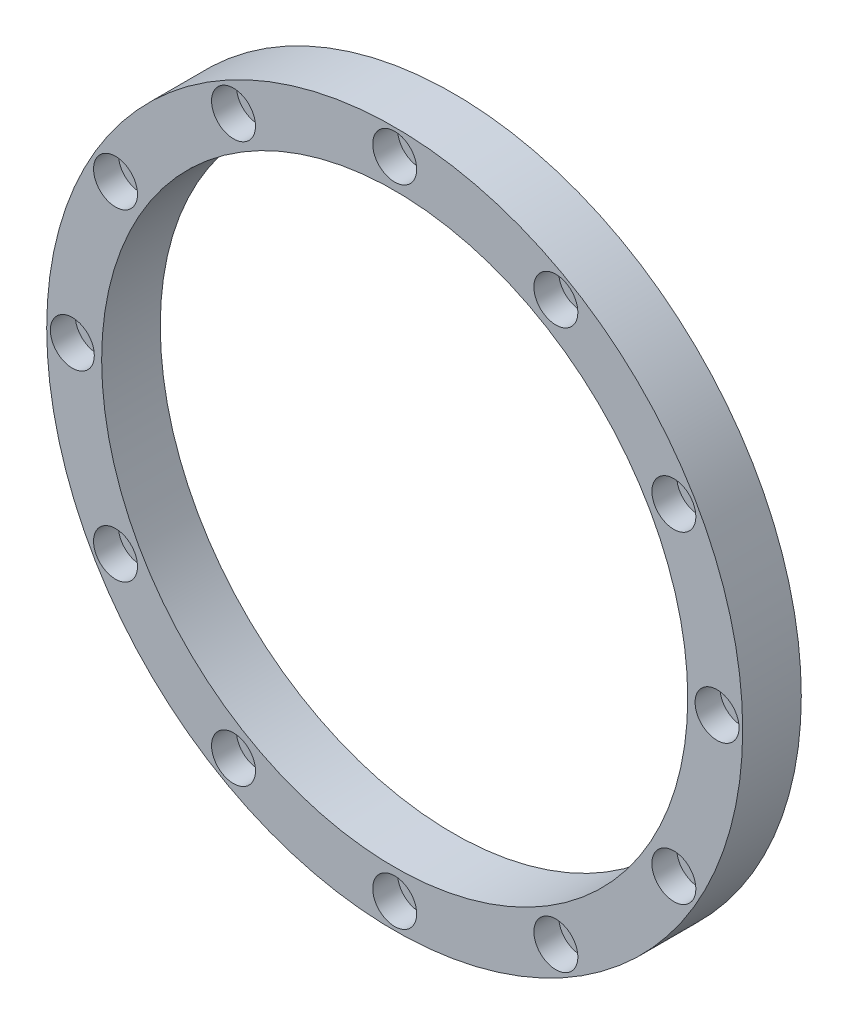
ISO-10303-21;
HEADER;
FILE_DESCRIPTION(('STEP AP214'),'2;1');
FILE_NAME('part.step','',(''),(''),'','','');
FILE_SCHEMA(('AUTOMOTIVE_DESIGN { 1 0 10303 214 1 1 1 1 }'));
ENDSEC;
DATA;
#1=APPLICATION_CONTEXT('core data for automotive mechanical design processes');
#2=APPLICATION_PROTOCOL_DEFINITION('international standard','automotive_design',2000,#1);
#3=PRODUCT_CONTEXT('',#1,'mechanical');
#4=PRODUCT('Part','Part','',(#3));
#5=PRODUCT_RELATED_PRODUCT_CATEGORY('part','',(#4));
#6=PRODUCT_DEFINITION_FORMATION('','',#4);
#7=PRODUCT_DEFINITION_CONTEXT('part definition',#1,'design');
#8=PRODUCT_DEFINITION('design','',#6,#7);
#9=PRODUCT_DEFINITION_SHAPE('','',#8);
#10=(LENGTH_UNIT() NAMED_UNIT(*) SI_UNIT(.MILLI.,.METRE.));
#11=(NAMED_UNIT(*) PLANE_ANGLE_UNIT() SI_UNIT($,.RADIAN.));
#12=(NAMED_UNIT(*) SI_UNIT($,.STERADIAN.) SOLID_ANGLE_UNIT());
#13=UNCERTAINTY_MEASURE_WITH_UNIT(LENGTH_MEASURE(1.E-05),#10,'distance_accuracy_value','');
#14=(GEOMETRIC_REPRESENTATION_CONTEXT(3) GLOBAL_UNCERTAINTY_ASSIGNED_CONTEXT((#13)) GLOBAL_UNIT_ASSIGNED_CONTEXT((#10,
#11,#12)) REPRESENTATION_CONTEXT('',''));
#15=CARTESIAN_POINT('',(0.,0.,0.));
#16=DIRECTION('',(0.,0.,1.));
#17=DIRECTION('',(1.,0.,0.));
#18=AXIS2_PLACEMENT_3D('',#15,#16,#17);
#19=CARTESIAN_POINT('',(0.,0.,8.));
#20=DIRECTION('',(0.,0.,-1.));
#21=DIRECTION('',(-1.,0.,0.));
#22=AXIS2_PLACEMENT_3D('',#19,#20,#21);
#23=CYLINDRICAL_SURFACE('',#22,47.5);
#24=CARTESIAN_POINT('',(0.,0.,8.));
#25=DIRECTION('',(0.,0.,1.));
#26=DIRECTION('',(1.,0.,0.));
#27=AXIS2_PLACEMENT_3D('',#24,#25,#26);
#28=CIRCLE('',#27,47.5);
#29=CARTESIAN_POINT('',(47.5,0.,8.));
#30=VERTEX_POINT('',#29);
#31=EDGE_CURVE('E10',#30,#30,#28,.T.);
#32=ORIENTED_EDGE('',*,*,#31,.F.);
#33=EDGE_LOOP('',(#32));
#34=FACE_BOUND('',#33,.T.);
#35=CARTESIAN_POINT('',(0.,0.,0.));
#36=DIRECTION('',(0.,0.,1.));
#37=DIRECTION('',(1.,0.,0.));
#38=AXIS2_PLACEMENT_3D('',#35,#36,#37);
#39=CIRCLE('',#38,47.5);
#40=CARTESIAN_POINT('',(47.5,0.,0.));
#41=VERTEX_POINT('',#40);
#42=EDGE_CURVE('E36',#41,#41,#39,.T.);
#43=ORIENTED_EDGE('',*,*,#42,.T.);
#44=EDGE_LOOP('',(#43));
#45=FACE_BOUND('',#44,.T.);
#46=ADVANCED_FACE('F33',(#34,#45),#23,.T.);
#47=CARTESIAN_POINT('',(0.,0.,8.));
#48=DIRECTION('',(0.,0.,1.));
#49=DIRECTION('',(1.,0.,0.));
#50=AXIS2_PLACEMENT_3D('',#47,#48,#49);
#51=PLANE('',#50);
#52=CARTESIAN_POINT('',(-21.9999999999995,38.1051177665156,8.));
#53=DIRECTION('',(0.,0.,1.));
#54=DIRECTION('',(1.,0.,0.));
#55=AXIS2_PLACEMENT_3D('',#52,#53,#54);
#56=CIRCLE('',#55,3.);
#57=CARTESIAN_POINT('',(-18.9999999999995,38.1051177665156,8.));
#58=VERTEX_POINT('',#57);
#59=EDGE_CURVE('E191',#58,#58,#56,.T.);
#60=ORIENTED_EDGE('',*,*,#59,.F.);
#61=EDGE_LOOP('',(#60));
#62=FACE_BOUND('',#61,.T.);
#63=CARTESIAN_POINT('',(-38.105117766515,22.0000000000004,8.));
#64=DIRECTION('',(0.,0.,1.));
#65=DIRECTION('',(1.,0.,0.));
#66=AXIS2_PLACEMENT_3D('',#63,#64,#65);
#67=CIRCLE('',#66,3.);
#68=CARTESIAN_POINT('',(-35.105117766515,22.0000000000004,8.));
#69=VERTEX_POINT('',#68);
#70=EDGE_CURVE('E179',#69,#69,#67,.T.);
#71=ORIENTED_EDGE('',*,*,#70,.F.);
#72=EDGE_LOOP('',(#71));
#73=FACE_BOUND('',#72,.T.);
#74=CARTESIAN_POINT('',(-44.,4.60875536727294E-13,8.));
#75=DIRECTION('',(0.,0.,1.));
#76=DIRECTION('',(1.,0.,0.));
#77=AXIS2_PLACEMENT_3D('',#74,#75,#76);
#78=CIRCLE('',#77,3.);
#79=CARTESIAN_POINT('',(-41.,4.60875536727294E-13,8.));
#80=VERTEX_POINT('',#79);
#81=EDGE_CURVE('E167',#80,#80,#78,.T.);
#82=ORIENTED_EDGE('',*,*,#81,.F.);
#83=EDGE_LOOP('',(#82));
#84=FACE_BOUND('',#83,.T.);
#85=CARTESIAN_POINT('',(-38.1051177665155,-21.9999999999996,8.));
#86=DIRECTION('',(0.,0.,1.));
#87=DIRECTION('',(1.,0.,0.));
#88=AXIS2_PLACEMENT_3D('',#85,#86,#87);
#89=CIRCLE('',#88,3.);
#90=CARTESIAN_POINT('',(-35.1051177665155,-21.9999999999996,8.));
#91=VERTEX_POINT('',#90);
#92=EDGE_CURVE('E155',#91,#91,#89,.T.);
#93=ORIENTED_EDGE('',*,*,#92,.F.);
#94=EDGE_LOOP('',(#93));
#95=FACE_BOUND('',#94,.T.);
#96=CARTESIAN_POINT('',(-22.0000000000003,-38.1051177665151,8.));
#97=DIRECTION('',(0.,0.,1.));
#98=DIRECTION('',(1.,0.,0.));
#99=AXIS2_PLACEMENT_3D('',#96,#97,#98);
#100=CIRCLE('',#99,3.);
#101=CARTESIAN_POINT('',(-19.0000000000003,-38.1051177665151,8.));
#102=VERTEX_POINT('',#101);
#103=EDGE_CURVE('E143',#102,#102,#100,.T.);
#104=ORIENTED_EDGE('',*,*,#103,.F.);
#105=EDGE_LOOP('',(#104));
#106=FACE_BOUND('',#105,.T.);
#107=CARTESIAN_POINT('',(0.,-44.,8.));
#108=DIRECTION('',(0.,0.,1.));
#109=DIRECTION('',(1.,0.,0.));
#110=AXIS2_PLACEMENT_3D('',#107,#108,#109);
#111=CIRCLE('',#110,3.);
#112=CARTESIAN_POINT('',(3.,-44.,8.));
#113=VERTEX_POINT('',#112);
#114=EDGE_CURVE('E131',#113,#113,#111,.T.);
#115=ORIENTED_EDGE('',*,*,#114,.F.);
#116=EDGE_LOOP('',(#115));
#117=FACE_BOUND('',#116,.T.);
#118=CARTESIAN_POINT('',(21.9999999999998,-38.1051177665154,8.));
#119=DIRECTION('',(0.,0.,1.));
#120=DIRECTION('',(1.,0.,0.));
#121=AXIS2_PLACEMENT_3D('',#118,#119,#120);
#122=CIRCLE('',#121,3.);
#123=CARTESIAN_POINT('',(24.9999999999998,-38.1051177665154,8.));
#124=VERTEX_POINT('',#123);
#125=EDGE_CURVE('E119',#124,#124,#122,.T.);
#126=ORIENTED_EDGE('',*,*,#125,.F.);
#127=EDGE_LOOP('',(#126));
#128=FACE_BOUND('',#127,.T.);
#129=CARTESIAN_POINT('',(38.1051177665152,-22.0000000000002,8.));
#130=DIRECTION('',(0.,0.,1.));
#131=DIRECTION('',(1.,0.,0.));
#132=AXIS2_PLACEMENT_3D('',#129,#130,#131);
#133=CIRCLE('',#132,3.);
#134=CARTESIAN_POINT('',(41.1051177665152,-22.0000000000002,8.));
#135=VERTEX_POINT('',#134);
#136=EDGE_CURVE('E107',#135,#135,#133,.T.);
#137=ORIENTED_EDGE('',*,*,#136,.F.);
#138=EDGE_LOOP('',(#137));
#139=FACE_BOUND('',#138,.T.);
#140=CARTESIAN_POINT('',(44.,-1.53625178909098E-13,8.));
#141=DIRECTION('',(0.,0.,1.));
#142=DIRECTION('',(1.,0.,0.));
#143=AXIS2_PLACEMENT_3D('',#140,#141,#142);
#144=CIRCLE('',#143,3.);
#145=CARTESIAN_POINT('',(47.,-1.53625178909098E-13,8.));
#146=VERTEX_POINT('',#145);
#147=EDGE_CURVE('E95',#146,#146,#144,.T.);
#148=ORIENTED_EDGE('',*,*,#147,.F.);
#149=EDGE_LOOP('',(#148));
#150=FACE_BOUND('',#149,.T.);
#151=CARTESIAN_POINT('',(38.1051177665153,21.9999999999999,8.));
#152=DIRECTION('',(0.,0.,1.));
#153=DIRECTION('',(1.,0.,0.));
#154=AXIS2_PLACEMENT_3D('',#151,#152,#153);
#155=CIRCLE('',#154,3.);
#156=CARTESIAN_POINT('',(41.1051177665154,21.9999999999999,8.));
#157=VERTEX_POINT('',#156);
#158=EDGE_CURVE('E83',#157,#157,#155,.T.);
#159=ORIENTED_EDGE('',*,*,#158,.F.);
#160=EDGE_LOOP('',(#159));
#161=FACE_BOUND('',#160,.T.);
#162=CARTESIAN_POINT('',(22.,38.1051177665153,8.));
#163=DIRECTION('',(0.,0.,1.));
#164=DIRECTION('',(1.,0.,0.));
#165=AXIS2_PLACEMENT_3D('',#162,#163,#164);
#166=CIRCLE('',#165,3.);
#167=CARTESIAN_POINT('',(25.,38.1051177665153,8.));
#168=VERTEX_POINT('',#167);
#169=EDGE_CURVE('E71',#168,#168,#166,.T.);
#170=ORIENTED_EDGE('',*,*,#169,.F.);
#171=EDGE_LOOP('',(#170));
#172=FACE_BOUND('',#171,.T.);
#173=CARTESIAN_POINT('',(0.,0.,8.));
#174=DIRECTION('',(0.,0.,1.));
#175=DIRECTION('',(1.,0.,0.));
#176=AXIS2_PLACEMENT_3D('',#173,#174,#175);
#177=CIRCLE('',#176,40.);
#178=CARTESIAN_POINT('',(40.,0.,8.));
#179=VERTEX_POINT('',#178);
#180=EDGE_CURVE('E57',#179,#179,#177,.T.);
#181=ORIENTED_EDGE('',*,*,#180,.F.);
#182=EDGE_LOOP('',(#181));
#183=FACE_BOUND('',#182,.T.);
#184=CARTESIAN_POINT('',(0.,44.,8.));
#185=DIRECTION('',(0.,0.,1.));
#186=DIRECTION('',(1.,0.,0.));
#187=AXIS2_PLACEMENT_3D('',#184,#185,#186);
#188=CIRCLE('',#187,3.);
#189=CARTESIAN_POINT('',(3.,44.,8.));
#190=VERTEX_POINT('',#189);
#191=EDGE_CURVE('E53',#190,#190,#188,.T.);
#192=ORIENTED_EDGE('',*,*,#191,.F.);
#193=EDGE_LOOP('',(#192));
#194=FACE_BOUND('',#193,.T.);
#195=ORIENTED_EDGE('',*,*,#31,.T.);
#196=EDGE_LOOP('',(#195));
#197=FACE_BOUND('',#196,.T.);
#198=ADVANCED_FACE('F197',(#62,#73,#84,#95,#106,#117,#128,#139,#150,#161,#172,#183,#194,#197),
#51,.T.);
#199=CARTESIAN_POINT('',(0.,0.,0.));
#200=DIRECTION('',(0.,0.,1.));
#201=DIRECTION('',(1.,0.,0.));
#202=AXIS2_PLACEMENT_3D('',#199,#200,#201);
#203=PLANE('',#202);
#204=CARTESIAN_POINT('',(-21.9999999999995,38.1051177665156,0.));
#205=DIRECTION('',(0.,0.,1.));
#206=DIRECTION('',(1.,0.,0.));
#207=AXIS2_PLACEMENT_3D('',#204,#205,#206);
#208=CIRCLE('',#207,1.7);
#209=CARTESIAN_POINT('',(-20.2999999999995,38.1051177665156,0.));
#210=VERTEX_POINT('',#209);
#211=EDGE_CURVE('E182',#210,#210,#208,.T.);
#212=ORIENTED_EDGE('',*,*,#211,.T.);
#213=EDGE_LOOP('',(#212));
#214=FACE_BOUND('',#213,.T.);
#215=CARTESIAN_POINT('',(-38.105117766515,22.0000000000004,0.));
#216=DIRECTION('',(0.,0.,1.));
#217=DIRECTION('',(1.,0.,0.));
#218=AXIS2_PLACEMENT_3D('',#215,#216,#217);
#219=CIRCLE('',#218,1.7);
#220=CARTESIAN_POINT('',(-36.405117766515,22.0000000000004,0.));
#221=VERTEX_POINT('',#220);
#222=EDGE_CURVE('E170',#221,#221,#219,.T.);
#223=ORIENTED_EDGE('',*,*,#222,.T.);
#224=EDGE_LOOP('',(#223));
#225=FACE_BOUND('',#224,.T.);
#226=CARTESIAN_POINT('',(-44.,4.60875536727294E-13,0.));
#227=DIRECTION('',(0.,0.,1.));
#228=DIRECTION('',(1.,0.,0.));
#229=AXIS2_PLACEMENT_3D('',#226,#227,#228);
#230=CIRCLE('',#229,1.7);
#231=CARTESIAN_POINT('',(-42.3,4.60875536727294E-13,0.));
#232=VERTEX_POINT('',#231);
#233=EDGE_CURVE('E158',#232,#232,#230,.T.);
#234=ORIENTED_EDGE('',*,*,#233,.T.);
#235=EDGE_LOOP('',(#234));
#236=FACE_BOUND('',#235,.T.);
#237=CARTESIAN_POINT('',(-38.1051177665155,-21.9999999999996,0.));
#238=DIRECTION('',(0.,0.,1.));
#239=DIRECTION('',(1.,0.,0.));
#240=AXIS2_PLACEMENT_3D('',#237,#238,#239);
#241=CIRCLE('',#240,1.7);
#242=CARTESIAN_POINT('',(-36.4051177665155,-21.9999999999996,0.));
#243=VERTEX_POINT('',#242);
#244=EDGE_CURVE('E146',#243,#243,#241,.T.);
#245=ORIENTED_EDGE('',*,*,#244,.T.);
#246=EDGE_LOOP('',(#245));
#247=FACE_BOUND('',#246,.T.);
#248=CARTESIAN_POINT('',(-22.0000000000003,-38.1051177665151,0.));
#249=DIRECTION('',(0.,0.,1.));
#250=DIRECTION('',(1.,0.,0.));
#251=AXIS2_PLACEMENT_3D('',#248,#249,#250);
#252=CIRCLE('',#251,1.7);
#253=CARTESIAN_POINT('',(-20.3000000000003,-38.1051177665151,0.));
#254=VERTEX_POINT('',#253);
#255=EDGE_CURVE('E134',#254,#254,#252,.T.);
#256=ORIENTED_EDGE('',*,*,#255,.T.);
#257=EDGE_LOOP('',(#256));
#258=FACE_BOUND('',#257,.T.);
#259=CARTESIAN_POINT('',(0.,-44.,0.));
#260=DIRECTION('',(0.,0.,1.));
#261=DIRECTION('',(1.,0.,0.));
#262=AXIS2_PLACEMENT_3D('',#259,#260,#261);
#263=CIRCLE('',#262,1.7);
#264=CARTESIAN_POINT('',(1.7,-44.,0.));
#265=VERTEX_POINT('',#264);
#266=EDGE_CURVE('E122',#265,#265,#263,.T.);
#267=ORIENTED_EDGE('',*,*,#266,.T.);
#268=EDGE_LOOP('',(#267));
#269=FACE_BOUND('',#268,.T.);
#270=CARTESIAN_POINT('',(21.9999999999998,-38.1051177665154,0.));
#271=DIRECTION('',(0.,0.,1.));
#272=DIRECTION('',(1.,0.,0.));
#273=AXIS2_PLACEMENT_3D('',#270,#271,#272);
#274=CIRCLE('',#273,1.7);
#275=CARTESIAN_POINT('',(23.6999999999998,-38.1051177665154,0.));
#276=VERTEX_POINT('',#275);
#277=EDGE_CURVE('E110',#276,#276,#274,.T.);
#278=ORIENTED_EDGE('',*,*,#277,.T.);
#279=EDGE_LOOP('',(#278));
#280=FACE_BOUND('',#279,.T.);
#281=CARTESIAN_POINT('',(38.1051177665152,-22.0000000000002,0.));
#282=DIRECTION('',(0.,0.,1.));
#283=DIRECTION('',(1.,0.,0.));
#284=AXIS2_PLACEMENT_3D('',#281,#282,#283);
#285=CIRCLE('',#284,1.7);
#286=CARTESIAN_POINT('',(39.8051177665152,-22.0000000000002,0.));
#287=VERTEX_POINT('',#286);
#288=EDGE_CURVE('E98',#287,#287,#285,.T.);
#289=ORIENTED_EDGE('',*,*,#288,.T.);
#290=EDGE_LOOP('',(#289));
#291=FACE_BOUND('',#290,.T.);
#292=CARTESIAN_POINT('',(44.,-1.53625178909098E-13,0.));
#293=DIRECTION('',(0.,0.,1.));
#294=DIRECTION('',(1.,0.,0.));
#295=AXIS2_PLACEMENT_3D('',#292,#293,#294);
#296=CIRCLE('',#295,1.7);
#297=CARTESIAN_POINT('',(45.7,-1.53625178909098E-13,0.));
#298=VERTEX_POINT('',#297);
#299=EDGE_CURVE('E86',#298,#298,#296,.T.);
#300=ORIENTED_EDGE('',*,*,#299,.T.);
#301=EDGE_LOOP('',(#300));
#302=FACE_BOUND('',#301,.T.);
#303=CARTESIAN_POINT('',(38.1051177665153,21.9999999999999,0.));
#304=DIRECTION('',(0.,0.,1.));
#305=DIRECTION('',(1.,0.,0.));
#306=AXIS2_PLACEMENT_3D('',#303,#304,#305);
#307=CIRCLE('',#306,1.7);
#308=CARTESIAN_POINT('',(39.8051177665154,21.9999999999999,0.));
#309=VERTEX_POINT('',#308);
#310=EDGE_CURVE('E74',#309,#309,#307,.T.);
#311=ORIENTED_EDGE('',*,*,#310,.T.);
#312=EDGE_LOOP('',(#311));
#313=FACE_BOUND('',#312,.T.);
#314=CARTESIAN_POINT('',(22.,38.1051177665153,0.));
#315=DIRECTION('',(0.,0.,1.));
#316=DIRECTION('',(1.,0.,0.));
#317=AXIS2_PLACEMENT_3D('',#314,#315,#316);
#318=CIRCLE('',#317,1.7);
#319=CARTESIAN_POINT('',(23.7,38.1051177665153,0.));
#320=VERTEX_POINT('',#319);
#321=EDGE_CURVE('E60',#320,#320,#318,.T.);
#322=ORIENTED_EDGE('',*,*,#321,.T.);
#323=EDGE_LOOP('',(#322));
#324=FACE_BOUND('',#323,.T.);
#325=CARTESIAN_POINT('',(0.,0.,0.));
#326=DIRECTION('',(0.,0.,1.));
#327=DIRECTION('',(1.,0.,0.));
#328=AXIS2_PLACEMENT_3D('',#325,#326,#327);
#329=CIRCLE('',#328,40.);
#330=CARTESIAN_POINT('',(40.,0.,0.));
#331=VERTEX_POINT('',#330);
#332=EDGE_CURVE('E56',#331,#331,#329,.T.);
#333=ORIENTED_EDGE('',*,*,#332,.T.);
#334=EDGE_LOOP('',(#333));
#335=FACE_BOUND('',#334,.T.);
#336=CARTESIAN_POINT('',(0.,44.,0.));
#337=DIRECTION('',(0.,0.,1.));
#338=DIRECTION('',(1.,0.,0.));
#339=AXIS2_PLACEMENT_3D('',#336,#337,#338);
#340=CIRCLE('',#339,1.7);
#341=CARTESIAN_POINT('',(1.7,44.,0.));
#342=VERTEX_POINT('',#341);
#343=EDGE_CURVE('E43',#342,#342,#340,.T.);
#344=ORIENTED_EDGE('',*,*,#343,.T.);
#345=EDGE_LOOP('',(#344));
#346=FACE_BOUND('',#345,.T.);
#347=ORIENTED_EDGE('',*,*,#42,.F.);
#348=EDGE_LOOP('',(#347));
#349=FACE_BOUND('',#348,.T.);
#350=ADVANCED_FACE('F200',(#214,#225,#236,#247,#258,#269,#280,#291,#302,#313,#324,#335,#346,
#349),#203,.F.);
#351=CARTESIAN_POINT('',(0.,44.,8.));
#352=DIRECTION('',(0.,0.,1.));
#353=DIRECTION('',(1.,0.,0.));
#354=AXIS2_PLACEMENT_3D('',#351,#352,#353);
#355=CYLINDRICAL_SURFACE('',#354,1.7);
#356=ORIENTED_EDGE('',*,*,#343,.F.);
#357=EDGE_LOOP('',(#356));
#358=FACE_BOUND('',#357,.T.);
#359=CARTESIAN_POINT('',(0.,44.,4.6));
#360=DIRECTION('',(0.,0.,1.));
#361=DIRECTION('',(1.,0.,0.));
#362=AXIS2_PLACEMENT_3D('',#359,#360,#361);
#363=CIRCLE('',#362,1.7);
#364=CARTESIAN_POINT('',(1.7,44.,4.6));
#365=VERTEX_POINT('',#364);
#366=EDGE_CURVE('E47',#365,#365,#363,.T.);
#367=ORIENTED_EDGE('',*,*,#366,.T.);
#368=EDGE_LOOP('',(#367));
#369=FACE_BOUND('',#368,.T.);
#370=ADVANCED_FACE('F239',(#358,#369),#355,.F.);
#371=CARTESIAN_POINT('',(1.7,44.,4.6));
#372=DIRECTION('',(0.,0.,-1.));
#373=DIRECTION('',(-1.,0.,0.));
#374=AXIS2_PLACEMENT_3D('',#371,#372,#373);
#375=PLANE('',#374);
#376=ORIENTED_EDGE('',*,*,#366,.F.);
#377=EDGE_LOOP('',(#376));
#378=FACE_BOUND('',#377,.T.);
#379=CARTESIAN_POINT('',(0.,44.,4.6));
#380=DIRECTION('',(0.,0.,1.));
#381=DIRECTION('',(1.,0.,0.));
#382=AXIS2_PLACEMENT_3D('',#379,#380,#381);
#383=CIRCLE('',#382,3.);
#384=CARTESIAN_POINT('',(3.,44.,4.6));
#385=VERTEX_POINT('',#384);
#386=EDGE_CURVE('E50',#385,#385,#383,.T.);
#387=ORIENTED_EDGE('',*,*,#386,.T.);
#388=EDGE_LOOP('',(#387));
#389=FACE_BOUND('',#388,.T.);
#390=ADVANCED_FACE('F229',(#378,#389),#375,.F.);
#391=CARTESIAN_POINT('',(0.,44.,8.));
#392=DIRECTION('',(0.,0.,1.));
#393=DIRECTION('',(1.,0.,0.));
#394=AXIS2_PLACEMENT_3D('',#391,#392,#393);
#395=CYLINDRICAL_SURFACE('',#394,3.);
#396=ORIENTED_EDGE('',*,*,#386,.F.);
#397=EDGE_LOOP('',(#396));
#398=FACE_BOUND('',#397,.T.);
#399=ORIENTED_EDGE('',*,*,#191,.T.);
#400=EDGE_LOOP('',(#399));
#401=FACE_BOUND('',#400,.T.);
#402=ADVANCED_FACE('F226',(#398,#401),#395,.F.);
#403=CARTESIAN_POINT('',(0.,0.,0.));
#404=DIRECTION('',(0.,0.,1.));
#405=DIRECTION('',(1.,0.,0.));
#406=AXIS2_PLACEMENT_3D('',#403,#404,#405);
#407=CYLINDRICAL_SURFACE('',#406,40.);
#408=ORIENTED_EDGE('',*,*,#332,.F.);
#409=EDGE_LOOP('',(#408));
#410=FACE_BOUND('',#409,.T.);
#411=ORIENTED_EDGE('',*,*,#180,.T.);
#412=EDGE_LOOP('',(#411));
#413=FACE_BOUND('',#412,.T.);
#414=ADVANCED_FACE('F228',(#410,#413),#407,.F.);
#415=CARTESIAN_POINT('',(22.,38.1051177665153,8.));
#416=DIRECTION('',(0.,0.,1.));
#417=DIRECTION('',(1.,0.,0.));
#418=AXIS2_PLACEMENT_3D('',#415,#416,#417);
#419=CYLINDRICAL_SURFACE('',#418,1.7);
#420=ORIENTED_EDGE('',*,*,#321,.F.);
#421=EDGE_LOOP('',(#420));
#422=FACE_BOUND('',#421,.T.);
#423=CARTESIAN_POINT('',(22.,38.1051177665153,4.6));
#424=DIRECTION('',(0.,0.,1.));
#425=DIRECTION('',(1.,0.,0.));
#426=AXIS2_PLACEMENT_3D('',#423,#424,#425);
#427=CIRCLE('',#426,1.7);
#428=CARTESIAN_POINT('',(23.7,38.1051177665153,4.6));
#429=VERTEX_POINT('',#428);
#430=EDGE_CURVE('E65',#429,#429,#427,.T.);
#431=ORIENTED_EDGE('',*,*,#430,.T.);
#432=EDGE_LOOP('',(#431));
#433=FACE_BOUND('',#432,.T.);
#434=ADVANCED_FACE('F236',(#422,#433),#419,.F.);
#435=CARTESIAN_POINT('',(23.7,38.1051177665153,4.6));
#436=DIRECTION('',(0.,0.,-1.));
#437=DIRECTION('',(-1.,0.,0.));
#438=AXIS2_PLACEMENT_3D('',#435,#436,#437);
#439=PLANE('',#438);
#440=ORIENTED_EDGE('',*,*,#430,.F.);
#441=EDGE_LOOP('',(#440));
#442=FACE_BOUND('',#441,.T.);
#443=CARTESIAN_POINT('',(22.,38.1051177665153,4.6));
#444=DIRECTION('',(0.,0.,1.));
#445=DIRECTION('',(1.,0.,0.));
#446=AXIS2_PLACEMENT_3D('',#443,#444,#445);
#447=CIRCLE('',#446,3.);
#448=CARTESIAN_POINT('',(25.,38.1051177665153,4.6));
#449=VERTEX_POINT('',#448);
#450=EDGE_CURVE('E68',#449,#449,#447,.T.);
#451=ORIENTED_EDGE('',*,*,#450,.T.);
#452=EDGE_LOOP('',(#451));
#453=FACE_BOUND('',#452,.T.);
#454=ADVANCED_FACE('F289',(#442,#453),#439,.F.);
#455=CARTESIAN_POINT('',(22.,38.1051177665153,8.));
#456=DIRECTION('',(0.,0.,1.));
#457=DIRECTION('',(1.,0.,0.));
#458=AXIS2_PLACEMENT_3D('',#455,#456,#457);
#459=CYLINDRICAL_SURFACE('',#458,3.);
#460=ORIENTED_EDGE('',*,*,#450,.F.);
#461=EDGE_LOOP('',(#460));
#462=FACE_BOUND('',#461,.T.);
#463=ORIENTED_EDGE('',*,*,#169,.T.);
#464=EDGE_LOOP('',(#463));
#465=FACE_BOUND('',#464,.T.);
#466=ADVANCED_FACE('F295',(#462,#465),#459,.F.);
#467=CARTESIAN_POINT('',(38.1051177665153,21.9999999999999,8.));
#468=DIRECTION('',(0.,0.,1.));
#469=DIRECTION('',(1.,0.,0.));
#470=AXIS2_PLACEMENT_3D('',#467,#468,#469);
#471=CYLINDRICAL_SURFACE('',#470,1.7);
#472=ORIENTED_EDGE('',*,*,#310,.F.);
#473=EDGE_LOOP('',(#472));
#474=FACE_BOUND('',#473,.T.);
#475=CARTESIAN_POINT('',(38.1051177665153,21.9999999999999,4.6));
#476=DIRECTION('',(0.,0.,1.));
#477=DIRECTION('',(1.,0.,0.));
#478=AXIS2_PLACEMENT_3D('',#475,#476,#477);
#479=CIRCLE('',#478,1.7);
#480=CARTESIAN_POINT('',(39.8051177665154,21.9999999999999,4.6));
#481=VERTEX_POINT('',#480);
#482=EDGE_CURVE('E77',#481,#481,#479,.T.);
#483=ORIENTED_EDGE('',*,*,#482,.T.);
#484=EDGE_LOOP('',(#483));
#485=FACE_BOUND('',#484,.T.);
#486=ADVANCED_FACE('F301',(#474,#485),#471,.F.);
#487=CARTESIAN_POINT('',(39.8051177665154,21.9999999999999,4.6));
#488=DIRECTION('',(0.,0.,-1.));
#489=DIRECTION('',(-1.,0.,0.));
#490=AXIS2_PLACEMENT_3D('',#487,#488,#489);
#491=PLANE('',#490);
#492=ORIENTED_EDGE('',*,*,#482,.F.);
#493=EDGE_LOOP('',(#492));
#494=FACE_BOUND('',#493,.T.);
#495=CARTESIAN_POINT('',(38.1051177665153,21.9999999999999,4.6));
#496=DIRECTION('',(0.,0.,1.));
#497=DIRECTION('',(1.,0.,0.));
#498=AXIS2_PLACEMENT_3D('',#495,#496,#497);
#499=CIRCLE('',#498,3.);
#500=CARTESIAN_POINT('',(41.1051177665153,21.9999999999999,4.6));
#501=VERTEX_POINT('',#500);
#502=EDGE_CURVE('E80',#501,#501,#499,.T.);
#503=ORIENTED_EDGE('',*,*,#502,.T.);
#504=EDGE_LOOP('',(#503));
#505=FACE_BOUND('',#504,.T.);
#506=ADVANCED_FACE('F306',(#494,#505),#491,.F.);
#507=CARTESIAN_POINT('',(38.1051177665153,21.9999999999999,8.));
#508=DIRECTION('',(0.,0.,1.));
#509=DIRECTION('',(1.,0.,0.));
#510=AXIS2_PLACEMENT_3D('',#507,#508,#509);
#511=CYLINDRICAL_SURFACE('',#510,3.);
#512=ORIENTED_EDGE('',*,*,#502,.F.);
#513=EDGE_LOOP('',(#512));
#514=FACE_BOUND('',#513,.T.);
#515=ORIENTED_EDGE('',*,*,#158,.T.);
#516=EDGE_LOOP('',(#515));
#517=FACE_BOUND('',#516,.T.);
#518=ADVANCED_FACE('F312',(#514,#517),#511,.F.);
#519=CARTESIAN_POINT('',(44.,-1.53625178909098E-13,8.));
#520=DIRECTION('',(0.,0.,1.));
#521=DIRECTION('',(1.,0.,0.));
#522=AXIS2_PLACEMENT_3D('',#519,#520,#521);
#523=CYLINDRICAL_SURFACE('',#522,1.7);
#524=ORIENTED_EDGE('',*,*,#299,.F.);
#525=EDGE_LOOP('',(#524));
#526=FACE_BOUND('',#525,.T.);
#527=CARTESIAN_POINT('',(44.,-1.53625178909098E-13,4.6));
#528=DIRECTION('',(0.,0.,1.));
#529=DIRECTION('',(1.,0.,0.));
#530=AXIS2_PLACEMENT_3D('',#527,#528,#529);
#531=CIRCLE('',#530,1.7);
#532=CARTESIAN_POINT('',(45.7,-1.53625178909098E-13,4.6));
#533=VERTEX_POINT('',#532);
#534=EDGE_CURVE('E89',#533,#533,#531,.T.);
#535=ORIENTED_EDGE('',*,*,#534,.T.);
#536=EDGE_LOOP('',(#535));
#537=FACE_BOUND('',#536,.T.);
#538=ADVANCED_FACE('F316',(#526,#537),#523,.F.);
#539=CARTESIAN_POINT('',(45.7,-1.53625178909098E-13,4.6));
#540=DIRECTION('',(0.,0.,-1.));
#541=DIRECTION('',(-1.,0.,0.));
#542=AXIS2_PLACEMENT_3D('',#539,#540,#541);
#543=PLANE('',#542);
#544=ORIENTED_EDGE('',*,*,#534,.F.);
#545=EDGE_LOOP('',(#544));
#546=FACE_BOUND('',#545,.T.);
#547=CARTESIAN_POINT('',(44.,-1.53625178909098E-13,4.6));
#548=DIRECTION('',(0.,0.,1.));
#549=DIRECTION('',(1.,0.,0.));
#550=AXIS2_PLACEMENT_3D('',#547,#548,#549);
#551=CIRCLE('',#550,3.);
#552=CARTESIAN_POINT('',(47.,-1.53625178909098E-13,4.6));
#553=VERTEX_POINT('',#552);
#554=EDGE_CURVE('E92',#553,#553,#551,.T.);
#555=ORIENTED_EDGE('',*,*,#554,.T.);
#556=EDGE_LOOP('',(#555));
#557=FACE_BOUND('',#556,.T.);
#558=ADVANCED_FACE('F320',(#546,#557),#543,.F.);
#559=CARTESIAN_POINT('',(44.,-1.53625178909098E-13,8.));
#560=DIRECTION('',(0.,0.,1.));
#561=DIRECTION('',(1.,0.,0.));
#562=AXIS2_PLACEMENT_3D('',#559,#560,#561);
#563=CYLINDRICAL_SURFACE('',#562,3.);
#564=ORIENTED_EDGE('',*,*,#554,.F.);
#565=EDGE_LOOP('',(#564));
#566=FACE_BOUND('',#565,.T.);
#567=ORIENTED_EDGE('',*,*,#147,.T.);
#568=EDGE_LOOP('',(#567));
#569=FACE_BOUND('',#568,.T.);
#570=ADVANCED_FACE('F324',(#566,#569),#563,.F.);
#571=CARTESIAN_POINT('',(38.1051177665152,-22.0000000000002,8.));
#572=DIRECTION('',(0.,0.,1.));
#573=DIRECTION('',(1.,0.,0.));
#574=AXIS2_PLACEMENT_3D('',#571,#572,#573);
#575=CYLINDRICAL_SURFACE('',#574,1.7);
#576=ORIENTED_EDGE('',*,*,#288,.F.);
#577=EDGE_LOOP('',(#576));
#578=FACE_BOUND('',#577,.T.);
#579=CARTESIAN_POINT('',(38.1051177665152,-22.0000000000002,4.6));
#580=DIRECTION('',(0.,0.,1.));
#581=DIRECTION('',(1.,0.,0.));
#582=AXIS2_PLACEMENT_3D('',#579,#580,#581);
#583=CIRCLE('',#582,1.7);
#584=CARTESIAN_POINT('',(39.8051177665152,-22.0000000000002,4.6));
#585=VERTEX_POINT('',#584);
#586=EDGE_CURVE('E101',#585,#585,#583,.T.);
#587=ORIENTED_EDGE('',*,*,#586,.T.);
#588=EDGE_LOOP('',(#587));
#589=FACE_BOUND('',#588,.T.);
#590=ADVANCED_FACE('F328',(#578,#589),#575,.F.);
#591=CARTESIAN_POINT('',(39.8051177665152,-22.0000000000002,4.6));
#592=DIRECTION('',(0.,0.,-1.));
#593=DIRECTION('',(-1.,0.,0.));
#594=AXIS2_PLACEMENT_3D('',#591,#592,#593);
#595=PLANE('',#594);
#596=ORIENTED_EDGE('',*,*,#586,.F.);
#597=EDGE_LOOP('',(#596));
#598=FACE_BOUND('',#597,.T.);
#599=CARTESIAN_POINT('',(38.1051177665152,-22.0000000000002,4.6));
#600=DIRECTION('',(0.,0.,1.));
#601=DIRECTION('',(1.,0.,0.));
#602=AXIS2_PLACEMENT_3D('',#599,#600,#601);
#603=CIRCLE('',#602,3.);
#604=CARTESIAN_POINT('',(41.1051177665152,-22.0000000000002,4.6));
#605=VERTEX_POINT('',#604);
#606=EDGE_CURVE('E104',#605,#605,#603,.T.);
#607=ORIENTED_EDGE('',*,*,#606,.T.);
#608=EDGE_LOOP('',(#607));
#609=FACE_BOUND('',#608,.T.);
#610=ADVANCED_FACE('F332',(#598,#609),#595,.F.);
#611=CARTESIAN_POINT('',(38.1051177665152,-22.0000000000002,8.));
#612=DIRECTION('',(0.,0.,1.));
#613=DIRECTION('',(1.,0.,0.));
#614=AXIS2_PLACEMENT_3D('',#611,#612,#613);
#615=CYLINDRICAL_SURFACE('',#614,3.);
#616=ORIENTED_EDGE('',*,*,#606,.F.);
#617=EDGE_LOOP('',(#616));
#618=FACE_BOUND('',#617,.T.);
#619=ORIENTED_EDGE('',*,*,#136,.T.);
#620=EDGE_LOOP('',(#619));
#621=FACE_BOUND('',#620,.T.);
#622=ADVANCED_FACE('F336',(#618,#621),#615,.F.);
#623=CARTESIAN_POINT('',(21.9999999999998,-38.1051177665154,8.));
#624=DIRECTION('',(0.,0.,1.));
#625=DIRECTION('',(1.,0.,0.));
#626=AXIS2_PLACEMENT_3D('',#623,#624,#625);
#627=CYLINDRICAL_SURFACE('',#626,1.7);
#628=ORIENTED_EDGE('',*,*,#277,.F.);
#629=EDGE_LOOP('',(#628));
#630=FACE_BOUND('',#629,.T.);
#631=CARTESIAN_POINT('',(21.9999999999998,-38.1051177665154,4.6));
#632=DIRECTION('',(0.,0.,1.));
#633=DIRECTION('',(1.,0.,0.));
#634=AXIS2_PLACEMENT_3D('',#631,#632,#633);
#635=CIRCLE('',#634,1.7);
#636=CARTESIAN_POINT('',(23.6999999999998,-38.1051177665154,4.6));
#637=VERTEX_POINT('',#636);
#638=EDGE_CURVE('E113',#637,#637,#635,.T.);
#639=ORIENTED_EDGE('',*,*,#638,.T.);
#640=EDGE_LOOP('',(#639));
#641=FACE_BOUND('',#640,.T.);
#642=ADVANCED_FACE('F340',(#630,#641),#627,.F.);
#643=CARTESIAN_POINT('',(23.6999999999998,-38.1051177665154,4.6));
#644=DIRECTION('',(0.,0.,-1.));
#645=DIRECTION('',(-1.,0.,0.));
#646=AXIS2_PLACEMENT_3D('',#643,#644,#645);
#647=PLANE('',#646);
#648=ORIENTED_EDGE('',*,*,#638,.F.);
#649=EDGE_LOOP('',(#648));
#650=FACE_BOUND('',#649,.T.);
#651=CARTESIAN_POINT('',(21.9999999999998,-38.1051177665154,4.6));
#652=DIRECTION('',(0.,0.,1.));
#653=DIRECTION('',(1.,0.,0.));
#654=AXIS2_PLACEMENT_3D('',#651,#652,#653);
#655=CIRCLE('',#654,3.);
#656=CARTESIAN_POINT('',(24.9999999999998,-38.1051177665154,4.6));
#657=VERTEX_POINT('',#656);
#658=EDGE_CURVE('E116',#657,#657,#655,.T.);
#659=ORIENTED_EDGE('',*,*,#658,.T.);
#660=EDGE_LOOP('',(#659));
#661=FACE_BOUND('',#660,.T.);
#662=ADVANCED_FACE('F344',(#650,#661),#647,.F.);
#663=CARTESIAN_POINT('',(21.9999999999998,-38.1051177665154,8.));
#664=DIRECTION('',(0.,0.,1.));
#665=DIRECTION('',(1.,0.,0.));
#666=AXIS2_PLACEMENT_3D('',#663,#664,#665);
#667=CYLINDRICAL_SURFACE('',#666,3.);
#668=ORIENTED_EDGE('',*,*,#658,.F.);
#669=EDGE_LOOP('',(#668));
#670=FACE_BOUND('',#669,.T.);
#671=ORIENTED_EDGE('',*,*,#125,.T.);
#672=EDGE_LOOP('',(#671));
#673=FACE_BOUND('',#672,.T.);
#674=ADVANCED_FACE('F348',(#670,#673),#667,.F.);
#675=CARTESIAN_POINT('',(0.,-44.,8.));
#676=DIRECTION('',(0.,0.,1.));
#677=DIRECTION('',(1.,0.,0.));
#678=AXIS2_PLACEMENT_3D('',#675,#676,#677);
#679=CYLINDRICAL_SURFACE('',#678,1.7);
#680=ORIENTED_EDGE('',*,*,#266,.F.);
#681=EDGE_LOOP('',(#680));
#682=FACE_BOUND('',#681,.T.);
#683=CARTESIAN_POINT('',(0.,-44.,4.6));
#684=DIRECTION('',(0.,0.,1.));
#685=DIRECTION('',(1.,0.,0.));
#686=AXIS2_PLACEMENT_3D('',#683,#684,#685);
#687=CIRCLE('',#686,1.7);
#688=CARTESIAN_POINT('',(1.7,-44.,4.6));
#689=VERTEX_POINT('',#688);
#690=EDGE_CURVE('E125',#689,#689,#687,.T.);
#691=ORIENTED_EDGE('',*,*,#690,.T.);
#692=EDGE_LOOP('',(#691));
#693=FACE_BOUND('',#692,.T.);
#694=ADVANCED_FACE('F352',(#682,#693),#679,.F.);
#695=CARTESIAN_POINT('',(1.7,-44.,4.6));
#696=DIRECTION('',(0.,0.,-1.));
#697=DIRECTION('',(-1.,0.,0.));
#698=AXIS2_PLACEMENT_3D('',#695,#696,#697);
#699=PLANE('',#698);
#700=ORIENTED_EDGE('',*,*,#690,.F.);
#701=EDGE_LOOP('',(#700));
#702=FACE_BOUND('',#701,.T.);
#703=CARTESIAN_POINT('',(0.,-44.,4.6));
#704=DIRECTION('',(0.,0.,1.));
#705=DIRECTION('',(1.,0.,0.));
#706=AXIS2_PLACEMENT_3D('',#703,#704,#705);
#707=CIRCLE('',#706,3.);
#708=CARTESIAN_POINT('',(3.,-44.,4.6));
#709=VERTEX_POINT('',#708);
#710=EDGE_CURVE('E128',#709,#709,#707,.T.);
#711=ORIENTED_EDGE('',*,*,#710,.T.);
#712=EDGE_LOOP('',(#711));
#713=FACE_BOUND('',#712,.T.);
#714=ADVANCED_FACE('F356',(#702,#713),#699,.F.);
#715=CARTESIAN_POINT('',(0.,-44.,8.));
#716=DIRECTION('',(0.,0.,1.));
#717=DIRECTION('',(1.,0.,0.));
#718=AXIS2_PLACEMENT_3D('',#715,#716,#717);
#719=CYLINDRICAL_SURFACE('',#718,3.);
#720=ORIENTED_EDGE('',*,*,#710,.F.);
#721=EDGE_LOOP('',(#720));
#722=FACE_BOUND('',#721,.T.);
#723=ORIENTED_EDGE('',*,*,#114,.T.);
#724=EDGE_LOOP('',(#723));
#725=FACE_BOUND('',#724,.T.);
#726=ADVANCED_FACE('F360',(#722,#725),#719,.F.);
#727=CARTESIAN_POINT('',(-22.0000000000003,-38.1051177665151,8.));
#728=DIRECTION('',(0.,0.,1.));
#729=DIRECTION('',(1.,0.,0.));
#730=AXIS2_PLACEMENT_3D('',#727,#728,#729);
#731=CYLINDRICAL_SURFACE('',#730,1.7);
#732=ORIENTED_EDGE('',*,*,#255,.F.);
#733=EDGE_LOOP('',(#732));
#734=FACE_BOUND('',#733,.T.);
#735=CARTESIAN_POINT('',(-22.0000000000003,-38.1051177665151,4.6));
#736=DIRECTION('',(0.,0.,1.));
#737=DIRECTION('',(1.,0.,0.));
#738=AXIS2_PLACEMENT_3D('',#735,#736,#737);
#739=CIRCLE('',#738,1.7);
#740=CARTESIAN_POINT('',(-20.3000000000003,-38.1051177665151,4.6));
#741=VERTEX_POINT('',#740);
#742=EDGE_CURVE('E137',#741,#741,#739,.T.);
#743=ORIENTED_EDGE('',*,*,#742,.T.);
#744=EDGE_LOOP('',(#743));
#745=FACE_BOUND('',#744,.T.);
#746=ADVANCED_FACE('F364',(#734,#745),#731,.F.);
#747=CARTESIAN_POINT('',(-20.3000000000003,-38.1051177665151,4.6));
#748=DIRECTION('',(0.,0.,-1.));
#749=DIRECTION('',(-1.,0.,0.));
#750=AXIS2_PLACEMENT_3D('',#747,#748,#749);
#751=PLANE('',#750);
#752=ORIENTED_EDGE('',*,*,#742,.F.);
#753=EDGE_LOOP('',(#752));
#754=FACE_BOUND('',#753,.T.);
#755=CARTESIAN_POINT('',(-22.0000000000003,-38.1051177665151,4.6));
#756=DIRECTION('',(0.,0.,1.));
#757=DIRECTION('',(1.,0.,0.));
#758=AXIS2_PLACEMENT_3D('',#755,#756,#757);
#759=CIRCLE('',#758,3.);
#760=CARTESIAN_POINT('',(-19.0000000000003,-38.1051177665151,4.6));
#761=VERTEX_POINT('',#760);
#762=EDGE_CURVE('E140',#761,#761,#759,.T.);
#763=ORIENTED_EDGE('',*,*,#762,.T.);
#764=EDGE_LOOP('',(#763));
#765=FACE_BOUND('',#764,.T.);
#766=ADVANCED_FACE('F368',(#754,#765),#751,.F.);
#767=CARTESIAN_POINT('',(-22.0000000000003,-38.1051177665151,8.));
#768=DIRECTION('',(0.,0.,1.));
#769=DIRECTION('',(1.,0.,0.));
#770=AXIS2_PLACEMENT_3D('',#767,#768,#769);
#771=CYLINDRICAL_SURFACE('',#770,3.);
#772=ORIENTED_EDGE('',*,*,#762,.F.);
#773=EDGE_LOOP('',(#772));
#774=FACE_BOUND('',#773,.T.);
#775=ORIENTED_EDGE('',*,*,#103,.T.);
#776=EDGE_LOOP('',(#775));
#777=FACE_BOUND('',#776,.T.);
#778=ADVANCED_FACE('F372',(#774,#777),#771,.F.);
#779=CARTESIAN_POINT('',(-38.1051177665155,-21.9999999999996,8.));
#780=DIRECTION('',(0.,0.,1.));
#781=DIRECTION('',(1.,0.,0.));
#782=AXIS2_PLACEMENT_3D('',#779,#780,#781);
#783=CYLINDRICAL_SURFACE('',#782,1.7);
#784=ORIENTED_EDGE('',*,*,#244,.F.);
#785=EDGE_LOOP('',(#784));
#786=FACE_BOUND('',#785,.T.);
#787=CARTESIAN_POINT('',(-38.1051177665155,-21.9999999999996,4.6));
#788=DIRECTION('',(0.,0.,1.));
#789=DIRECTION('',(1.,0.,0.));
#790=AXIS2_PLACEMENT_3D('',#787,#788,#789);
#791=CIRCLE('',#790,1.7);
#792=CARTESIAN_POINT('',(-36.4051177665155,-21.9999999999996,4.6));
#793=VERTEX_POINT('',#792);
#794=EDGE_CURVE('E149',#793,#793,#791,.T.);
#795=ORIENTED_EDGE('',*,*,#794,.T.);
#796=EDGE_LOOP('',(#795));
#797=FACE_BOUND('',#796,.T.);
#798=ADVANCED_FACE('F376',(#786,#797),#783,.F.);
#799=CARTESIAN_POINT('',(-36.4051177665155,-21.9999999999996,4.6));
#800=DIRECTION('',(0.,0.,-1.));
#801=DIRECTION('',(-1.,0.,0.));
#802=AXIS2_PLACEMENT_3D('',#799,#800,#801);
#803=PLANE('',#802);
#804=ORIENTED_EDGE('',*,*,#794,.F.);
#805=EDGE_LOOP('',(#804));
#806=FACE_BOUND('',#805,.T.);
#807=CARTESIAN_POINT('',(-38.1051177665155,-21.9999999999996,4.6));
#808=DIRECTION('',(0.,0.,1.));
#809=DIRECTION('',(1.,0.,0.));
#810=AXIS2_PLACEMENT_3D('',#807,#808,#809);
#811=CIRCLE('',#810,3.);
#812=CARTESIAN_POINT('',(-35.1051177665155,-21.9999999999996,4.6));
#813=VERTEX_POINT('',#812);
#814=EDGE_CURVE('E152',#813,#813,#811,.T.);
#815=ORIENTED_EDGE('',*,*,#814,.T.);
#816=EDGE_LOOP('',(#815));
#817=FACE_BOUND('',#816,.T.);
#818=ADVANCED_FACE('F380',(#806,#817),#803,.F.);
#819=CARTESIAN_POINT('',(-38.1051177665155,-21.9999999999996,8.));
#820=DIRECTION('',(0.,0.,1.));
#821=DIRECTION('',(1.,0.,0.));
#822=AXIS2_PLACEMENT_3D('',#819,#820,#821);
#823=CYLINDRICAL_SURFACE('',#822,3.);
#824=ORIENTED_EDGE('',*,*,#814,.F.);
#825=EDGE_LOOP('',(#824));
#826=FACE_BOUND('',#825,.T.);
#827=ORIENTED_EDGE('',*,*,#92,.T.);
#828=EDGE_LOOP('',(#827));
#829=FACE_BOUND('',#828,.T.);
#830=ADVANCED_FACE('F384',(#826,#829),#823,.F.);
#831=CARTESIAN_POINT('',(-44.,4.60875536727294E-13,8.));
#832=DIRECTION('',(0.,0.,1.));
#833=DIRECTION('',(1.,0.,0.));
#834=AXIS2_PLACEMENT_3D('',#831,#832,#833);
#835=CYLINDRICAL_SURFACE('',#834,1.7);
#836=ORIENTED_EDGE('',*,*,#233,.F.);
#837=EDGE_LOOP('',(#836));
#838=FACE_BOUND('',#837,.T.);
#839=CARTESIAN_POINT('',(-44.,4.60875536727294E-13,4.6));
#840=DIRECTION('',(0.,0.,1.));
#841=DIRECTION('',(1.,0.,0.));
#842=AXIS2_PLACEMENT_3D('',#839,#840,#841);
#843=CIRCLE('',#842,1.7);
#844=CARTESIAN_POINT('',(-42.3,4.60875536727294E-13,4.6));
#845=VERTEX_POINT('',#844);
#846=EDGE_CURVE('E161',#845,#845,#843,.T.);
#847=ORIENTED_EDGE('',*,*,#846,.T.);
#848=EDGE_LOOP('',(#847));
#849=FACE_BOUND('',#848,.T.);
#850=ADVANCED_FACE('F388',(#838,#849),#835,.F.);
#851=CARTESIAN_POINT('',(-42.3,4.60875536727294E-13,4.6));
#852=DIRECTION('',(0.,0.,-1.));
#853=DIRECTION('',(-1.,0.,0.));
#854=AXIS2_PLACEMENT_3D('',#851,#852,#853);
#855=PLANE('',#854);
#856=ORIENTED_EDGE('',*,*,#846,.F.);
#857=EDGE_LOOP('',(#856));
#858=FACE_BOUND('',#857,.T.);
#859=CARTESIAN_POINT('',(-44.,4.60875536727294E-13,4.6));
#860=DIRECTION('',(0.,0.,1.));
#861=DIRECTION('',(1.,0.,0.));
#862=AXIS2_PLACEMENT_3D('',#859,#860,#861);
#863=CIRCLE('',#862,3.);
#864=CARTESIAN_POINT('',(-41.,4.60875536727294E-13,4.6));
#865=VERTEX_POINT('',#864);
#866=EDGE_CURVE('E164',#865,#865,#863,.T.);
#867=ORIENTED_EDGE('',*,*,#866,.T.);
#868=EDGE_LOOP('',(#867));
#869=FACE_BOUND('',#868,.T.);
#870=ADVANCED_FACE('F392',(#858,#869),#855,.F.);
#871=CARTESIAN_POINT('',(-44.,4.60875536727294E-13,8.));
#872=DIRECTION('',(0.,0.,1.));
#873=DIRECTION('',(1.,0.,0.));
#874=AXIS2_PLACEMENT_3D('',#871,#872,#873);
#875=CYLINDRICAL_SURFACE('',#874,3.);
#876=ORIENTED_EDGE('',*,*,#866,.F.);
#877=EDGE_LOOP('',(#876));
#878=FACE_BOUND('',#877,.T.);
#879=ORIENTED_EDGE('',*,*,#81,.T.);
#880=EDGE_LOOP('',(#879));
#881=FACE_BOUND('',#880,.T.);
#882=ADVANCED_FACE('F396',(#878,#881),#875,.F.);
#883=CARTESIAN_POINT('',(-38.105117766515,22.0000000000004,8.));
#884=DIRECTION('',(0.,0.,1.));
#885=DIRECTION('',(1.,0.,0.));
#886=AXIS2_PLACEMENT_3D('',#883,#884,#885);
#887=CYLINDRICAL_SURFACE('',#886,1.7);
#888=ORIENTED_EDGE('',*,*,#222,.F.);
#889=EDGE_LOOP('',(#888));
#890=FACE_BOUND('',#889,.T.);
#891=CARTESIAN_POINT('',(-38.105117766515,22.0000000000004,4.6));
#892=DIRECTION('',(0.,0.,1.));
#893=DIRECTION('',(1.,0.,0.));
#894=AXIS2_PLACEMENT_3D('',#891,#892,#893);
#895=CIRCLE('',#894,1.7);
#896=CARTESIAN_POINT('',(-36.405117766515,22.0000000000004,4.6));
#897=VERTEX_POINT('',#896);
#898=EDGE_CURVE('E173',#897,#897,#895,.T.);
#899=ORIENTED_EDGE('',*,*,#898,.T.);
#900=EDGE_LOOP('',(#899));
#901=FACE_BOUND('',#900,.T.);
#902=ADVANCED_FACE('F400',(#890,#901),#887,.F.);
#903=CARTESIAN_POINT('',(-36.405117766515,22.0000000000004,4.6));
#904=DIRECTION('',(0.,0.,-1.));
#905=DIRECTION('',(-1.,0.,0.));
#906=AXIS2_PLACEMENT_3D('',#903,#904,#905);
#907=PLANE('',#906);
#908=ORIENTED_EDGE('',*,*,#898,.F.);
#909=EDGE_LOOP('',(#908));
#910=FACE_BOUND('',#909,.T.);
#911=CARTESIAN_POINT('',(-38.105117766515,22.0000000000004,4.6));
#912=DIRECTION('',(0.,0.,1.));
#913=DIRECTION('',(1.,0.,0.));
#914=AXIS2_PLACEMENT_3D('',#911,#912,#913);
#915=CIRCLE('',#914,3.);
#916=CARTESIAN_POINT('',(-35.105117766515,22.0000000000004,4.6));
#917=VERTEX_POINT('',#916);
#918=EDGE_CURVE('E176',#917,#917,#915,.T.);
#919=ORIENTED_EDGE('',*,*,#918,.T.);
#920=EDGE_LOOP('',(#919));
#921=FACE_BOUND('',#920,.T.);
#922=ADVANCED_FACE('F404',(#910,#921),#907,.F.);
#923=CARTESIAN_POINT('',(-38.105117766515,22.0000000000004,8.));
#924=DIRECTION('',(0.,0.,1.));
#925=DIRECTION('',(1.,0.,0.));
#926=AXIS2_PLACEMENT_3D('',#923,#924,#925);
#927=CYLINDRICAL_SURFACE('',#926,3.);
#928=ORIENTED_EDGE('',*,*,#918,.F.);
#929=EDGE_LOOP('',(#928));
#930=FACE_BOUND('',#929,.T.);
#931=ORIENTED_EDGE('',*,*,#70,.T.);
#932=EDGE_LOOP('',(#931));
#933=FACE_BOUND('',#932,.T.);
#934=ADVANCED_FACE('F408',(#930,#933),#927,.F.);
#935=CARTESIAN_POINT('',(-21.9999999999995,38.1051177665156,8.));
#936=DIRECTION('',(0.,0.,1.));
#937=DIRECTION('',(1.,0.,0.));
#938=AXIS2_PLACEMENT_3D('',#935,#936,#937);
#939=CYLINDRICAL_SURFACE('',#938,1.7);
#940=ORIENTED_EDGE('',*,*,#211,.F.);
#941=EDGE_LOOP('',(#940));
#942=FACE_BOUND('',#941,.T.);
#943=CARTESIAN_POINT('',(-21.9999999999995,38.1051177665156,4.6));
#944=DIRECTION('',(0.,0.,1.));
#945=DIRECTION('',(1.,0.,0.));
#946=AXIS2_PLACEMENT_3D('',#943,#944,#945);
#947=CIRCLE('',#946,1.7);
#948=CARTESIAN_POINT('',(-20.2999999999995,38.1051177665156,4.6));
#949=VERTEX_POINT('',#948);
#950=EDGE_CURVE('E185',#949,#949,#947,.T.);
#951=ORIENTED_EDGE('',*,*,#950,.T.);
#952=EDGE_LOOP('',(#951));
#953=FACE_BOUND('',#952,.T.);
#954=ADVANCED_FACE('F412',(#942,#953),#939,.F.);
#955=CARTESIAN_POINT('',(-20.2999999999995,38.1051177665156,4.6));
#956=DIRECTION('',(0.,0.,-1.));
#957=DIRECTION('',(-1.,0.,0.));
#958=AXIS2_PLACEMENT_3D('',#955,#956,#957);
#959=PLANE('',#958);
#960=ORIENTED_EDGE('',*,*,#950,.F.);
#961=EDGE_LOOP('',(#960));
#962=FACE_BOUND('',#961,.T.);
#963=CARTESIAN_POINT('',(-21.9999999999995,38.1051177665156,4.6));
#964=DIRECTION('',(0.,0.,1.));
#965=DIRECTION('',(1.,0.,0.));
#966=AXIS2_PLACEMENT_3D('',#963,#964,#965);
#967=CIRCLE('',#966,3.);
#968=CARTESIAN_POINT('',(-18.9999999999995,38.1051177665156,4.6));
#969=VERTEX_POINT('',#968);
#970=EDGE_CURVE('E188',#969,#969,#967,.T.);
#971=ORIENTED_EDGE('',*,*,#970,.T.);
#972=EDGE_LOOP('',(#971));
#973=FACE_BOUND('',#972,.T.);
#974=ADVANCED_FACE('F416',(#962,#973),#959,.F.);
#975=CARTESIAN_POINT('',(-21.9999999999995,38.1051177665156,8.));
#976=DIRECTION('',(0.,0.,1.));
#977=DIRECTION('',(1.,0.,0.));
#978=AXIS2_PLACEMENT_3D('',#975,#976,#977);
#979=CYLINDRICAL_SURFACE('',#978,3.);
#980=ORIENTED_EDGE('',*,*,#970,.F.);
#981=EDGE_LOOP('',(#980));
#982=FACE_BOUND('',#981,.T.);
#983=ORIENTED_EDGE('',*,*,#59,.T.);
#984=EDGE_LOOP('',(#983));
#985=FACE_BOUND('',#984,.T.);
#986=ADVANCED_FACE('F195',(#982,#985),#979,.F.);
#987=CLOSED_SHELL('',(#46,#198,#350,#370,#390,#402,#414,#434,#454,#466,#486,#506,#518,#538,#558,
#570,#590,#610,#622,#642,#662,#674,#694,#714,#726,#746,#766,#778,#798,#818,#830,#850,#870,#882,
#902,#922,#934,#954,#974,#986));
#988=MANIFOLD_SOLID_BREP('B2',#987);
#989=ADVANCED_BREP_SHAPE_REPRESENTATION('',(#18,#988),#14);
#990=SHAPE_DEFINITION_REPRESENTATION(#9,#989);
ENDSEC;
END-ISO-10303-21;
